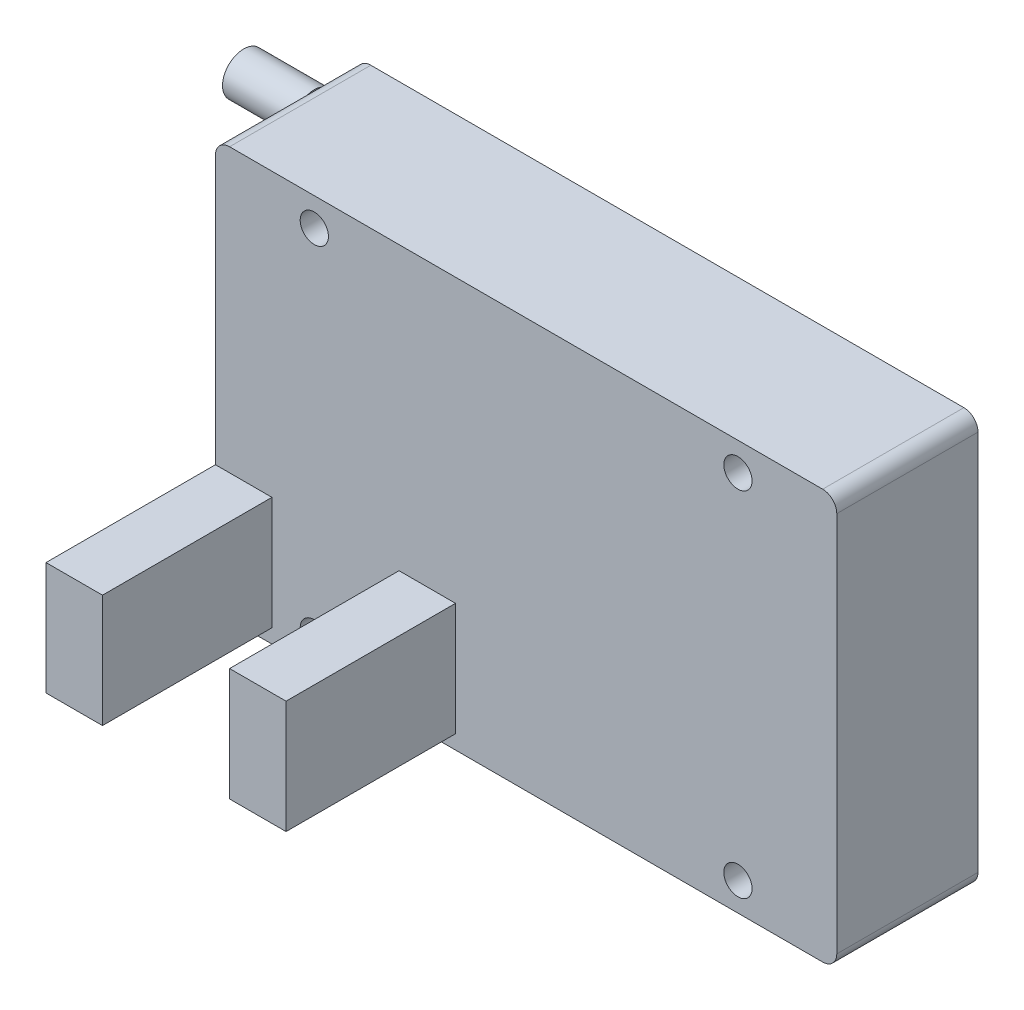
ISO-10303-21;
HEADER;
FILE_DESCRIPTION(('STEP AP214'),'2;1');
FILE_NAME('part.step','',(''),(''),'','','');
FILE_SCHEMA(('AUTOMOTIVE_DESIGN { 1 0 10303 214 1 1 1 1 }'));
ENDSEC;
DATA;
#1=APPLICATION_CONTEXT('core data for automotive mechanical design processes');
#2=APPLICATION_PROTOCOL_DEFINITION('international standard','automotive_design',2000,#1);
#3=PRODUCT_CONTEXT('',#1,'mechanical');
#4=PRODUCT('Part','Part','',(#3));
#5=PRODUCT_RELATED_PRODUCT_CATEGORY('part','',(#4));
#6=PRODUCT_DEFINITION_FORMATION('','',#4);
#7=PRODUCT_DEFINITION_CONTEXT('part definition',#1,'design');
#8=PRODUCT_DEFINITION('design','',#6,#7);
#9=PRODUCT_DEFINITION_SHAPE('','',#8);
#10=(LENGTH_UNIT() NAMED_UNIT(*) SI_UNIT(.MILLI.,.METRE.));
#11=(NAMED_UNIT(*) PLANE_ANGLE_UNIT() SI_UNIT($,.RADIAN.));
#12=(NAMED_UNIT(*) SI_UNIT($,.STERADIAN.) SOLID_ANGLE_UNIT());
#13=UNCERTAINTY_MEASURE_WITH_UNIT(LENGTH_MEASURE(1.E-05),#10,'distance_accuracy_value','');
#14=(GEOMETRIC_REPRESENTATION_CONTEXT(3) GLOBAL_UNCERTAINTY_ASSIGNED_CONTEXT((#13)) GLOBAL_UNIT_ASSIGNED_CONTEXT((#10,
#11,#12)) REPRESENTATION_CONTEXT('',''));
#15=CARTESIAN_POINT('',(0.,0.,0.));
#16=DIRECTION('',(0.,0.,1.));
#17=DIRECTION('',(1.,0.,0.));
#18=AXIS2_PLACEMENT_3D('',#15,#16,#17);
#19=CARTESIAN_POINT('',(21.,-13.5,10.));
#20=DIRECTION('',(0.,0.,-1.));
#21=DIRECTION('',(-1.,0.,0.));
#22=AXIS2_PLACEMENT_3D('',#19,#20,#21);
#23=CYLINDRICAL_SURFACE('',#22,1.);
#24=CARTESIAN_POINT('',(21.,-13.5,0.));
#25=DIRECTION('',(0.,0.,1.));
#26=DIRECTION('',(1.,0.,0.));
#27=AXIS2_PLACEMENT_3D('',#24,#25,#26);
#28=CIRCLE('',#27,1.);
#29=CARTESIAN_POINT('',(21.,-14.5,0.));
#30=VERTEX_POINT('',#29);
#31=CARTESIAN_POINT('',(22.,-13.5,0.));
#32=VERTEX_POINT('',#31);
#33=EDGE_CURVE('E220',#30,#32,#28,.T.);
#34=ORIENTED_EDGE('',*,*,#33,.T.);
#35=DIRECTION('',(0.,0.,-1.));
#36=VECTOR('',#35,1.);
#37=CARTESIAN_POINT('',(22.,-13.5,10.));
#38=LINE('',#37,#36);
#39=CARTESIAN_POINT('',(22.,-13.5,10.));
#40=VERTEX_POINT('',#39);
#41=EDGE_CURVE('E285',#40,#32,#38,.T.);
#42=ORIENTED_EDGE('',*,*,#41,.F.);
#43=CARTESIAN_POINT('',(21.,-13.5,10.));
#44=DIRECTION('',(0.,0.,1.));
#45=DIRECTION('',(1.,0.,0.));
#46=AXIS2_PLACEMENT_3D('',#43,#44,#45);
#47=CIRCLE('',#46,1.);
#48=CARTESIAN_POINT('',(21.,-14.5,10.));
#49=VERTEX_POINT('',#48);
#50=EDGE_CURVE('E223',#49,#40,#47,.T.);
#51=ORIENTED_EDGE('',*,*,#50,.F.);
#52=DIRECTION('',(0.,0.,-1.));
#53=VECTOR('',#52,1.);
#54=CARTESIAN_POINT('',(21.,-14.5,10.));
#55=LINE('',#54,#53);
#56=EDGE_CURVE('E244',#49,#30,#55,.T.);
#57=ORIENTED_EDGE('',*,*,#56,.T.);
#58=EDGE_LOOP('',(#34,#42,#51,#57));
#59=FACE_BOUND('',#58,.T.);
#60=ADVANCED_FACE('F39',(#59),#23,.T.);
#61=CARTESIAN_POINT('',(22.,-13.5,10.));
#62=DIRECTION('',(-1.,0.,0.));
#63=DIRECTION('',(0.,0.,1.));
#64=AXIS2_PLACEMENT_3D('',#61,#62,#63);
#65=PLANE('',#64);
#66=DIRECTION('',(0.,1.,0.));
#67=VECTOR('',#66,1.);
#68=CARTESIAN_POINT('',(22.,-13.5,0.));
#69=LINE('',#68,#67);
#70=CARTESIAN_POINT('',(22.,13.5,0.));
#71=VERTEX_POINT('',#70);
#72=EDGE_CURVE('E249',#32,#71,#69,.T.);
#73=ORIENTED_EDGE('',*,*,#72,.T.);
#74=DIRECTION('',(0.,0.,-1.));
#75=VECTOR('',#74,1.);
#76=CARTESIAN_POINT('',(22.,13.5,10.));
#77=LINE('',#76,#75);
#78=CARTESIAN_POINT('',(22.,13.5,10.));
#79=VERTEX_POINT('',#78);
#80=EDGE_CURVE('E276',#79,#71,#77,.T.);
#81=ORIENTED_EDGE('',*,*,#80,.F.);
#82=DIRECTION('',(0.,1.,0.));
#83=VECTOR('',#82,1.);
#84=CARTESIAN_POINT('',(22.,-13.5,10.));
#85=LINE('',#84,#83);
#86=EDGE_CURVE('E226',#40,#79,#85,.T.);
#87=ORIENTED_EDGE('',*,*,#86,.F.);
#88=ORIENTED_EDGE('',*,*,#41,.T.);
#89=EDGE_LOOP('',(#73,#81,#87,#88));
#90=FACE_BOUND('',#89,.T.);
#91=ADVANCED_FACE('F326',(#90),#65,.F.);
#92=CARTESIAN_POINT('',(21.,13.5,10.));
#93=DIRECTION('',(0.,0.,-1.));
#94=DIRECTION('',(-1.,0.,0.));
#95=AXIS2_PLACEMENT_3D('',#92,#93,#94);
#96=CYLINDRICAL_SURFACE('',#95,1.);
#97=CARTESIAN_POINT('',(21.,13.5,0.));
#98=DIRECTION('',(0.,0.,1.));
#99=DIRECTION('',(1.,0.,0.));
#100=AXIS2_PLACEMENT_3D('',#97,#98,#99);
#101=CIRCLE('',#100,1.);
#102=CARTESIAN_POINT('',(21.,14.5,0.));
#103=VERTEX_POINT('',#102);
#104=EDGE_CURVE('E250',#71,#103,#101,.T.);
#105=ORIENTED_EDGE('',*,*,#104,.T.);
#106=DIRECTION('',(0.,0.,-1.));
#107=VECTOR('',#106,1.);
#108=CARTESIAN_POINT('',(21.,14.5,10.));
#109=LINE('',#108,#107);
#110=CARTESIAN_POINT('',(21.,14.5,10.));
#111=VERTEX_POINT('',#110);
#112=EDGE_CURVE('E277',#111,#103,#109,.T.);
#113=ORIENTED_EDGE('',*,*,#112,.F.);
#114=CARTESIAN_POINT('',(21.,13.5,10.));
#115=DIRECTION('',(0.,0.,1.));
#116=DIRECTION('',(1.,0.,0.));
#117=AXIS2_PLACEMENT_3D('',#114,#115,#116);
#118=CIRCLE('',#117,1.);
#119=EDGE_CURVE('E233',#79,#111,#118,.T.);
#120=ORIENTED_EDGE('',*,*,#119,.F.);
#121=ORIENTED_EDGE('',*,*,#80,.T.);
#122=EDGE_LOOP('',(#105,#113,#120,#121));
#123=FACE_BOUND('',#122,.T.);
#124=ADVANCED_FACE('F332',(#123),#96,.T.);
#125=CARTESIAN_POINT('',(-21.,14.5,10.));
#126=DIRECTION('',(0.,-1.,0.));
#127=DIRECTION('',(1.,0.,0.));
#128=AXIS2_PLACEMENT_3D('',#125,#126,#127);
#129=PLANE('',#128);
#130=DIRECTION('',(-1.,0.,0.));
#131=VECTOR('',#130,1.);
#132=CARTESIAN_POINT('',(-21.,14.5,0.));
#133=LINE('',#132,#131);
#134=CARTESIAN_POINT('',(-21.,14.5,0.));
#135=VERTEX_POINT('',#134);
#136=EDGE_CURVE('E253',#103,#135,#133,.T.);
#137=ORIENTED_EDGE('',*,*,#136,.T.);
#138=DIRECTION('',(0.,0.,-1.));
#139=VECTOR('',#138,1.);
#140=CARTESIAN_POINT('',(-21.,14.5,10.));
#141=LINE('',#140,#139);
#142=CARTESIAN_POINT('',(-21.,14.5,10.));
#143=VERTEX_POINT('',#142);
#144=EDGE_CURVE('E275',#143,#135,#141,.T.);
#145=ORIENTED_EDGE('',*,*,#144,.F.);
#146=DIRECTION('',(-1.,0.,0.));
#147=VECTOR('',#146,1.);
#148=CARTESIAN_POINT('',(-21.,14.5,10.));
#149=LINE('',#148,#147);
#150=EDGE_CURVE('E232',#111,#143,#149,.T.);
#151=ORIENTED_EDGE('',*,*,#150,.F.);
#152=ORIENTED_EDGE('',*,*,#112,.T.);
#153=EDGE_LOOP('',(#137,#145,#151,#152));
#154=FACE_BOUND('',#153,.T.);
#155=ADVANCED_FACE('F364',(#154),#129,.F.);
#156=CARTESIAN_POINT('',(-21.,13.5,10.));
#157=DIRECTION('',(0.,0.,-1.));
#158=DIRECTION('',(-1.,0.,0.));
#159=AXIS2_PLACEMENT_3D('',#156,#157,#158);
#160=CYLINDRICAL_SURFACE('',#159,1.);
#161=CARTESIAN_POINT('',(-21.,13.5,0.));
#162=DIRECTION('',(0.,0.,1.));
#163=DIRECTION('',(-1.,0.,0.));
#164=AXIS2_PLACEMENT_3D('',#161,#162,#163);
#165=CIRCLE('',#164,1.);
#166=CARTESIAN_POINT('',(-22.,13.5,0.));
#167=VERTEX_POINT('',#166);
#168=EDGE_CURVE('E251',#135,#167,#165,.T.);
#169=ORIENTED_EDGE('',*,*,#168,.T.);
#170=DIRECTION('',(0.,0.,-1.));
#171=VECTOR('',#170,1.);
#172=CARTESIAN_POINT('',(-22.,13.5,10.));
#173=LINE('',#172,#171);
#174=CARTESIAN_POINT('',(-22.,13.5,1.8819660112501));
#175=VERTEX_POINT('',#174);
#176=EDGE_CURVE('E267',#175,#167,#173,.T.);
#177=ORIENTED_EDGE('',*,*,#176,.F.);
#178=CARTESIAN_POINT('',(-22.,13.5,4.1180339887499));
#179=VERTEX_POINT('',#178);
#180=EDGE_CURVE('E272',#179,#175,#173,.T.);
#181=ORIENTED_EDGE('',*,*,#180,.F.);
#182=CARTESIAN_POINT('',(-22.,13.5,10.));
#183=VERTEX_POINT('',#182);
#184=EDGE_CURVE('E269',#183,#179,#173,.T.);
#185=ORIENTED_EDGE('',*,*,#184,.F.);
#186=CARTESIAN_POINT('',(-21.,13.5,10.));
#187=DIRECTION('',(0.,0.,1.));
#188=DIRECTION('',(-1.,0.,0.));
#189=AXIS2_PLACEMENT_3D('',#186,#187,#188);
#190=CIRCLE('',#189,1.);
#191=EDGE_CURVE('E231',#143,#183,#190,.T.);
#192=ORIENTED_EDGE('',*,*,#191,.F.);
#193=ORIENTED_EDGE('',*,*,#144,.T.);
#194=EDGE_LOOP('',(#169,#177,#181,#185,#192,#193));
#195=FACE_BOUND('',#194,.T.);
#196=ADVANCED_FACE('F297',(#195),#160,.T.);
#197=CARTESIAN_POINT('',(-22.,-13.5,10.));
#198=DIRECTION('',(1.,0.,0.));
#199=DIRECTION('',(0.,0.,-1.));
#200=AXIS2_PLACEMENT_3D('',#197,#198,#199);
#201=PLANE('',#200);
#202=CARTESIAN_POINT('',(-22.,12.5,3.));
#203=DIRECTION('',(-1.,0.,0.));
#204=DIRECTION('',(0.,0.,1.));
#205=AXIS2_PLACEMENT_3D('',#202,#203,#204);
#206=CIRCLE('',#205,1.5);
#207=EDGE_CURVE('E11',#175,#179,#206,.T.);
#208=ORIENTED_EDGE('',*,*,#207,.F.);
#209=ORIENTED_EDGE('',*,*,#176,.T.);
#210=DIRECTION('',(0.,-1.,0.));
#211=VECTOR('',#210,1.);
#212=CARTESIAN_POINT('',(-22.,-13.5,0.));
#213=LINE('',#212,#211);
#214=CARTESIAN_POINT('',(-22.,-13.5,0.));
#215=VERTEX_POINT('',#214);
#216=EDGE_CURVE('E258',#167,#215,#213,.T.);
#217=ORIENTED_EDGE('',*,*,#216,.T.);
#218=DIRECTION('',(0.,0.,-1.));
#219=VECTOR('',#218,1.);
#220=CARTESIAN_POINT('',(-22.,-13.5,10.));
#221=LINE('',#220,#219);
#222=CARTESIAN_POINT('',(-22.,-13.5,10.));
#223=VERTEX_POINT('',#222);
#224=EDGE_CURVE('E266',#223,#215,#221,.T.);
#225=ORIENTED_EDGE('',*,*,#224,.F.);
#226=DIRECTION('',(0.,0.,-1.));
#227=VECTOR('',#226,1.);
#228=CARTESIAN_POINT('',(-22.,-13.5,22.));
#229=LINE('',#228,#227);
#230=CARTESIAN_POINT('',(-22.,-13.5,22.));
#231=VERTEX_POINT('',#230);
#232=EDGE_CURVE('E208',#231,#223,#229,.T.);
#233=ORIENTED_EDGE('',*,*,#232,.F.);
#234=DIRECTION('',(0.,-1.,0.));
#235=VECTOR('',#234,1.);
#236=CARTESIAN_POINT('',(-22.,0.,22.));
#237=LINE('',#236,#235);
#238=CARTESIAN_POINT('',(-22.,-5.5,22.));
#239=VERTEX_POINT('',#238);
#240=EDGE_CURVE('E192',#239,#231,#237,.T.);
#241=ORIENTED_EDGE('',*,*,#240,.F.);
#242=DIRECTION('',(0.,0.,-1.));
#243=VECTOR('',#242,1.);
#244=CARTESIAN_POINT('',(-22.,-5.5,22.));
#245=LINE('',#244,#243);
#246=CARTESIAN_POINT('',(-22.,-5.5,10.));
#247=VERTEX_POINT('',#246);
#248=EDGE_CURVE('E209',#239,#247,#245,.T.);
#249=ORIENTED_EDGE('',*,*,#248,.T.);
#250=DIRECTION('',(0.,-1.,0.));
#251=VECTOR('',#250,1.);
#252=CARTESIAN_POINT('',(-22.,-13.5,10.));
#253=LINE('',#252,#251);
#254=EDGE_CURVE('E240',#183,#247,#253,.T.);
#255=ORIENTED_EDGE('',*,*,#254,.F.);
#256=ORIENTED_EDGE('',*,*,#184,.T.);
#257=EDGE_LOOP('',(#208,#209,#217,#225,#233,#241,#249,#255,#256));
#258=FACE_BOUND('',#257,.T.);
#259=CARTESIAN_POINT('',(-22.,-0.500000000000007,3.));
#260=DIRECTION('',(1.,0.,0.));
#261=DIRECTION('',(0.,0.,-1.));
#262=AXIS2_PLACEMENT_3D('',#259,#260,#261);
#263=CIRCLE('',#262,1.5);
#264=CARTESIAN_POINT('',(-22.,-0.500000000000007,1.5));
#265=VERTEX_POINT('',#264);
#266=EDGE_CURVE('E45',#265,#265,#263,.F.);
#267=ORIENTED_EDGE('',*,*,#266,.F.);
#268=EDGE_LOOP('',(#267));
#269=FACE_BOUND('',#268,.T.);
#270=CARTESIAN_POINT('',(-22.,-6.50000000000001,3.));
#271=DIRECTION('',(1.,0.,0.));
#272=DIRECTION('',(0.,0.,-1.));
#273=AXIS2_PLACEMENT_3D('',#270,#271,#272);
#274=CIRCLE('',#273,1.5);
#275=CARTESIAN_POINT('',(-22.,-6.50000000000001,1.5));
#276=VERTEX_POINT('',#275);
#277=EDGE_CURVE('E289',#276,#276,#274,.F.);
#278=ORIENTED_EDGE('',*,*,#277,.F.);
#279=EDGE_LOOP('',(#278));
#280=FACE_BOUND('',#279,.T.);
#281=CARTESIAN_POINT('',(-22.,-11.5,3.));
#282=DIRECTION('',(1.,0.,0.));
#283=DIRECTION('',(0.,0.,-1.));
#284=AXIS2_PLACEMENT_3D('',#281,#282,#283);
#285=CIRCLE('',#284,1.5);
#286=CARTESIAN_POINT('',(-22.,-11.5,1.5));
#287=VERTEX_POINT('',#286);
#288=EDGE_CURVE('E282',#287,#287,#285,.F.);
#289=ORIENTED_EDGE('',*,*,#288,.F.);
#290=EDGE_LOOP('',(#289));
#291=FACE_BOUND('',#290,.T.);
#292=ADVANCED_FACE('F298',(#258,#269,#280,#291),#201,.F.);
#293=CARTESIAN_POINT('',(-21.,-13.5,10.));
#294=DIRECTION('',(0.,0.,-1.));
#295=DIRECTION('',(-1.,0.,0.));
#296=AXIS2_PLACEMENT_3D('',#293,#294,#295);
#297=CYLINDRICAL_SURFACE('',#296,1.);
#298=CARTESIAN_POINT('',(-21.,-13.5,0.));
#299=DIRECTION('',(0.,0.,1.));
#300=DIRECTION('',(1.,0.,0.));
#301=AXIS2_PLACEMENT_3D('',#298,#299,#300);
#302=CIRCLE('',#301,1.);
#303=CARTESIAN_POINT('',(-21.,-14.5,0.));
#304=VERTEX_POINT('',#303);
#305=EDGE_CURVE('E256',#215,#304,#302,.T.);
#306=ORIENTED_EDGE('',*,*,#305,.T.);
#307=DIRECTION('',(0.,0.,-1.));
#308=VECTOR('',#307,1.);
#309=CARTESIAN_POINT('',(-21.,-14.5,10.));
#310=LINE('',#309,#308);
#311=CARTESIAN_POINT('',(-21.,-14.5,10.));
#312=VERTEX_POINT('',#311);
#313=EDGE_CURVE('E263',#312,#304,#310,.T.);
#314=ORIENTED_EDGE('',*,*,#313,.F.);
#315=CARTESIAN_POINT('',(-21.,-13.5,10.));
#316=DIRECTION('',(0.,0.,1.));
#317=DIRECTION('',(1.,0.,0.));
#318=AXIS2_PLACEMENT_3D('',#315,#316,#317);
#319=CIRCLE('',#318,1.);
#320=EDGE_CURVE('E238',#223,#312,#319,.T.);
#321=ORIENTED_EDGE('',*,*,#320,.F.);
#322=ORIENTED_EDGE('',*,*,#224,.T.);
#323=EDGE_LOOP('',(#306,#314,#321,#322));
#324=FACE_BOUND('',#323,.T.);
#325=ADVANCED_FACE('F299',(#324),#297,.T.);
#326=CARTESIAN_POINT('',(-21.,-14.5,10.));
#327=DIRECTION('',(0.,1.,0.));
#328=DIRECTION('',(-1.,0.,0.));
#329=AXIS2_PLACEMENT_3D('',#326,#327,#328);
#330=PLANE('',#329);
#331=DIRECTION('',(1.,0.,0.));
#332=VECTOR('',#331,1.);
#333=CARTESIAN_POINT('',(-21.,-14.5,0.));
#334=LINE('',#333,#332);
#335=EDGE_CURVE('E229',#304,#30,#334,.T.);
#336=ORIENTED_EDGE('',*,*,#335,.T.);
#337=ORIENTED_EDGE('',*,*,#56,.F.);
#338=DIRECTION('',(1.,0.,0.));
#339=VECTOR('',#338,1.);
#340=CARTESIAN_POINT('',(-21.,-14.5,10.));
#341=LINE('',#340,#339);
#342=EDGE_CURVE('E245',#312,#49,#341,.T.);
#343=ORIENTED_EDGE('',*,*,#342,.F.);
#344=ORIENTED_EDGE('',*,*,#313,.T.);
#345=EDGE_LOOP('',(#336,#337,#343,#344));
#346=FACE_BOUND('',#345,.T.);
#347=ADVANCED_FACE('F348',(#346),#330,.F.);
#348=CARTESIAN_POINT('',(21.,-13.5,10.));
#349=DIRECTION('',(0.,0.,1.));
#350=DIRECTION('',(1.,0.,0.));
#351=AXIS2_PLACEMENT_3D('',#348,#349,#350);
#352=PLANE('',#351);
#353=CARTESIAN_POINT('',(-15.,12.5,10.));
#354=DIRECTION('',(0.,0.,1.));
#355=DIRECTION('',(1.,0.,0.));
#356=AXIS2_PLACEMENT_3D('',#353,#354,#355);
#357=CIRCLE('',#356,1.);
#358=CARTESIAN_POINT('',(-14.,12.5,10.));
#359=VERTEX_POINT('',#358);
#360=EDGE_CURVE('E205',#359,#359,#357,.T.);
#361=ORIENTED_EDGE('',*,*,#360,.F.);
#362=EDGE_LOOP('',(#361));
#363=FACE_BOUND('',#362,.T.);
#364=CARTESIAN_POINT('',(15.,12.5,10.));
#365=DIRECTION('',(0.,0.,1.));
#366=DIRECTION('',(1.,0.,0.));
#367=AXIS2_PLACEMENT_3D('',#364,#365,#366);
#368=CIRCLE('',#367,1.);
#369=CARTESIAN_POINT('',(16.,12.5,10.));
#370=VERTEX_POINT('',#369);
#371=EDGE_CURVE('E595',#370,#370,#368,.T.);
#372=ORIENTED_EDGE('',*,*,#371,.F.);
#373=EDGE_LOOP('',(#372));
#374=FACE_BOUND('',#373,.T.);
#375=CARTESIAN_POINT('',(15.,-12.5,10.));
#376=DIRECTION('',(0.,0.,1.));
#377=DIRECTION('',(1.,0.,0.));
#378=AXIS2_PLACEMENT_3D('',#375,#376,#377);
#379=CIRCLE('',#378,1.);
#380=CARTESIAN_POINT('',(16.,-12.5,10.));
#381=VERTEX_POINT('',#380);
#382=EDGE_CURVE('E589',#381,#381,#379,.T.);
#383=ORIENTED_EDGE('',*,*,#382,.F.);
#384=EDGE_LOOP('',(#383));
#385=FACE_BOUND('',#384,.T.);
#386=CARTESIAN_POINT('',(-15.,-12.5,10.));
#387=DIRECTION('',(0.,0.,1.));
#388=DIRECTION('',(1.,0.,0.));
#389=AXIS2_PLACEMENT_3D('',#386,#387,#388);
#390=CIRCLE('',#389,1.);
#391=CARTESIAN_POINT('',(-14.,-12.5,10.));
#392=VERTEX_POINT('',#391);
#393=EDGE_CURVE('E588',#392,#392,#390,.T.);
#394=ORIENTED_EDGE('',*,*,#393,.F.);
#395=EDGE_LOOP('',(#394));
#396=FACE_BOUND('',#395,.T.);
#397=DIRECTION('',(0.,-1.,0.));
#398=VECTOR('',#397,1.);
#399=CARTESIAN_POINT('',(-9.,0.,10.));
#400=LINE('',#399,#398);
#401=CARTESIAN_POINT('',(-9.,-5.5,10.));
#402=VERTEX_POINT('',#401);
#403=CARTESIAN_POINT('',(-9.,-13.5,10.));
#404=VERTEX_POINT('',#403);
#405=EDGE_CURVE('E54',#402,#404,#400,.T.);
#406=ORIENTED_EDGE('',*,*,#405,.F.);
#407=DIRECTION('',(1.,0.,0.));
#408=VECTOR('',#407,1.);
#409=CARTESIAN_POINT('',(0.,-5.5,10.));
#410=LINE('',#409,#408);
#411=CARTESIAN_POINT('',(-5.,-5.5,10.));
#412=VERTEX_POINT('',#411);
#413=EDGE_CURVE('E58',#402,#412,#410,.T.);
#414=ORIENTED_EDGE('',*,*,#413,.T.);
#415=DIRECTION('',(0.,-1.,0.));
#416=VECTOR('',#415,1.);
#417=CARTESIAN_POINT('',(-5.,0.,10.));
#418=LINE('',#417,#416);
#419=CARTESIAN_POINT('',(-5.,-13.5,10.));
#420=VERTEX_POINT('',#419);
#421=EDGE_CURVE('E605',#412,#420,#418,.T.);
#422=ORIENTED_EDGE('',*,*,#421,.T.);
#423=DIRECTION('',(1.,0.,0.));
#424=VECTOR('',#423,1.);
#425=CARTESIAN_POINT('',(0.,-13.5,10.));
#426=LINE('',#425,#424);
#427=EDGE_CURVE('E599',#404,#420,#426,.T.);
#428=ORIENTED_EDGE('',*,*,#427,.F.);
#429=EDGE_LOOP('',(#406,#414,#422,#428));
#430=FACE_BOUND('',#429,.T.);
#431=DIRECTION('',(1.,0.,0.));
#432=VECTOR('',#431,1.);
#433=CARTESIAN_POINT('',(0.,-13.5,10.));
#434=LINE('',#433,#432);
#435=CARTESIAN_POINT('',(-18.,-13.5,10.));
#436=VERTEX_POINT('',#435);
#437=EDGE_CURVE('E187',#223,#436,#434,.T.);
#438=ORIENTED_EDGE('',*,*,#437,.F.);
#439=ORIENTED_EDGE('',*,*,#320,.T.);
#440=ORIENTED_EDGE('',*,*,#342,.T.);
#441=ORIENTED_EDGE('',*,*,#50,.T.);
#442=ORIENTED_EDGE('',*,*,#86,.T.);
#443=ORIENTED_EDGE('',*,*,#119,.T.);
#444=ORIENTED_EDGE('',*,*,#150,.T.);
#445=ORIENTED_EDGE('',*,*,#191,.T.);
#446=ORIENTED_EDGE('',*,*,#254,.T.);
#447=DIRECTION('',(1.,0.,0.));
#448=VECTOR('',#447,1.);
#449=CARTESIAN_POINT('',(0.,-5.5,10.));
#450=LINE('',#449,#448);
#451=CARTESIAN_POINT('',(-18.,-5.5,10.));
#452=VERTEX_POINT('',#451);
#453=EDGE_CURVE('E203',#247,#452,#450,.T.);
#454=ORIENTED_EDGE('',*,*,#453,.T.);
#455=DIRECTION('',(0.,-1.,0.));
#456=VECTOR('',#455,1.);
#457=CARTESIAN_POINT('',(-18.,0.,10.));
#458=LINE('',#457,#456);
#459=EDGE_CURVE('E196',#452,#436,#458,.T.);
#460=ORIENTED_EDGE('',*,*,#459,.T.);
#461=EDGE_LOOP('',(#438,#439,#440,#441,#442,#443,#444,#445,#446,#454,#460));
#462=FACE_BOUND('',#461,.T.);
#463=ADVANCED_FACE('F319',(#363,#374,#385,#396,#430,#462),#352,.T.);
#464=CARTESIAN_POINT('',(21.,-13.5,0.));
#465=DIRECTION('',(0.,0.,1.));
#466=DIRECTION('',(1.,0.,0.));
#467=AXIS2_PLACEMENT_3D('',#464,#465,#466);
#468=PLANE('',#467);
#469=CARTESIAN_POINT('',(-15.,12.5,0.));
#470=DIRECTION('',(0.,0.,-1.));
#471=DIRECTION('',(-1.,0.,0.));
#472=AXIS2_PLACEMENT_3D('',#469,#470,#471);
#473=CIRCLE('',#472,1.);
#474=CARTESIAN_POINT('',(-16.,12.5,0.));
#475=VERTEX_POINT('',#474);
#476=EDGE_CURVE('E572',#475,#475,#473,.T.);
#477=ORIENTED_EDGE('',*,*,#476,.F.);
#478=EDGE_LOOP('',(#477));
#479=FACE_BOUND('',#478,.T.);
#480=CARTESIAN_POINT('',(15.,12.5,0.));
#481=DIRECTION('',(0.,0.,-1.));
#482=DIRECTION('',(-1.,0.,0.));
#483=AXIS2_PLACEMENT_3D('',#480,#481,#482);
#484=CIRCLE('',#483,1.);
#485=CARTESIAN_POINT('',(14.,12.5,0.));
#486=VERTEX_POINT('',#485);
#487=EDGE_CURVE('E578',#486,#486,#484,.T.);
#488=ORIENTED_EDGE('',*,*,#487,.F.);
#489=EDGE_LOOP('',(#488));
#490=FACE_BOUND('',#489,.T.);
#491=CARTESIAN_POINT('',(15.,-12.5,0.));
#492=DIRECTION('',(0.,0.,-1.));
#493=DIRECTION('',(-1.,0.,0.));
#494=AXIS2_PLACEMENT_3D('',#491,#492,#493);
#495=CIRCLE('',#494,1.);
#496=CARTESIAN_POINT('',(14.,-12.5,0.));
#497=VERTEX_POINT('',#496);
#498=EDGE_CURVE('E580',#497,#497,#495,.T.);
#499=ORIENTED_EDGE('',*,*,#498,.F.);
#500=EDGE_LOOP('',(#499));
#501=FACE_BOUND('',#500,.T.);
#502=CARTESIAN_POINT('',(-15.,-12.5,0.));
#503=DIRECTION('',(0.,0.,-1.));
#504=DIRECTION('',(-1.,0.,0.));
#505=AXIS2_PLACEMENT_3D('',#502,#503,#504);
#506=CIRCLE('',#505,1.);
#507=CARTESIAN_POINT('',(-16.,-12.5,0.));
#508=VERTEX_POINT('',#507);
#509=EDGE_CURVE('E581',#508,#508,#506,.T.);
#510=ORIENTED_EDGE('',*,*,#509,.F.);
#511=EDGE_LOOP('',(#510));
#512=FACE_BOUND('',#511,.T.);
#513=ORIENTED_EDGE('',*,*,#33,.F.);
#514=ORIENTED_EDGE('',*,*,#335,.F.);
#515=ORIENTED_EDGE('',*,*,#305,.F.);
#516=ORIENTED_EDGE('',*,*,#216,.F.);
#517=ORIENTED_EDGE('',*,*,#168,.F.);
#518=ORIENTED_EDGE('',*,*,#136,.F.);
#519=ORIENTED_EDGE('',*,*,#104,.F.);
#520=ORIENTED_EDGE('',*,*,#72,.F.);
#521=EDGE_LOOP('',(#513,#514,#515,#516,#517,#518,#519,#520));
#522=FACE_BOUND('',#521,.T.);
#523=ADVANCED_FACE('F310',(#479,#490,#501,#512,#522),#468,.F.);
#524=CARTESIAN_POINT('',(-27.,-11.5,3.));
#525=DIRECTION('',(1.,0.,0.));
#526=DIRECTION('',(0.,0.,-1.));
#527=AXIS2_PLACEMENT_3D('',#524,#525,#526);
#528=CYLINDRICAL_SURFACE('',#527,1.5);
#529=CARTESIAN_POINT('',(-27.,-11.5,3.));
#530=DIRECTION('',(-1.,0.,0.));
#531=DIRECTION('',(0.,0.,1.));
#532=AXIS2_PLACEMENT_3D('',#529,#530,#531);
#533=CIRCLE('',#532,1.5);
#534=CARTESIAN_POINT('',(-27.,-11.5,4.5));
#535=VERTEX_POINT('',#534);
#536=EDGE_CURVE('E179',#535,#535,#533,.T.);
#537=ORIENTED_EDGE('',*,*,#536,.F.);
#538=EDGE_LOOP('',(#537));
#539=FACE_BOUND('',#538,.T.);
#540=ORIENTED_EDGE('',*,*,#288,.T.);
#541=EDGE_LOOP('',(#540));
#542=FACE_BOUND('',#541,.T.);
#543=ADVANCED_FACE('F308',(#539,#542),#528,.T.);
#544=CARTESIAN_POINT('',(-27.,-11.5,3.));
#545=DIRECTION('',(-1.,0.,0.));
#546=DIRECTION('',(0.,0.,1.));
#547=AXIS2_PLACEMENT_3D('',#544,#545,#546);
#548=PLANE('',#547);
#549=ORIENTED_EDGE('',*,*,#536,.T.);
#550=EDGE_LOOP('',(#549));
#551=FACE_BOUND('',#550,.T.);
#552=ADVANCED_FACE('F306',(#551),#548,.T.);
#553=CARTESIAN_POINT('',(-27.,-6.50000000000001,3.));
#554=DIRECTION('',(1.,0.,0.));
#555=DIRECTION('',(0.,0.,-1.));
#556=AXIS2_PLACEMENT_3D('',#553,#554,#555);
#557=CYLINDRICAL_SURFACE('',#556,1.5);
#558=CARTESIAN_POINT('',(-27.,-6.50000000000001,3.));
#559=DIRECTION('',(-1.,0.,0.));
#560=DIRECTION('',(0.,0.,1.));
#561=AXIS2_PLACEMENT_3D('',#558,#559,#560);
#562=CIRCLE('',#561,1.5);
#563=CARTESIAN_POINT('',(-27.,-6.50000000000001,4.5));
#564=VERTEX_POINT('',#563);
#565=EDGE_CURVE('E176',#564,#564,#562,.T.);
#566=ORIENTED_EDGE('',*,*,#565,.F.);
#567=EDGE_LOOP('',(#566));
#568=FACE_BOUND('',#567,.T.);
#569=ORIENTED_EDGE('',*,*,#277,.T.);
#570=EDGE_LOOP('',(#569));
#571=FACE_BOUND('',#570,.T.);
#572=ADVANCED_FACE('F316',(#568,#571),#557,.T.);
#573=CARTESIAN_POINT('',(-27.,-6.50000000000001,3.));
#574=DIRECTION('',(-1.,0.,0.));
#575=DIRECTION('',(0.,0.,1.));
#576=AXIS2_PLACEMENT_3D('',#573,#574,#575);
#577=PLANE('',#576);
#578=ORIENTED_EDGE('',*,*,#565,.T.);
#579=EDGE_LOOP('',(#578));
#580=FACE_BOUND('',#579,.T.);
#581=ADVANCED_FACE('F414',(#580),#577,.T.);
#582=CARTESIAN_POINT('',(-27.,-0.500000000000007,3.));
#583=DIRECTION('',(1.,0.,0.));
#584=DIRECTION('',(0.,0.,-1.));
#585=AXIS2_PLACEMENT_3D('',#582,#583,#584);
#586=CYLINDRICAL_SURFACE('',#585,1.5);
#587=CARTESIAN_POINT('',(-27.,-0.500000000000007,3.));
#588=DIRECTION('',(-1.,0.,0.));
#589=DIRECTION('',(0.,0.,1.));
#590=AXIS2_PLACEMENT_3D('',#587,#588,#589);
#591=CIRCLE('',#590,1.5);
#592=CARTESIAN_POINT('',(-27.,-0.500000000000007,4.5));
#593=VERTEX_POINT('',#592);
#594=EDGE_CURVE('E219',#593,#593,#591,.T.);
#595=ORIENTED_EDGE('',*,*,#594,.F.);
#596=EDGE_LOOP('',(#595));
#597=FACE_BOUND('',#596,.T.);
#598=ORIENTED_EDGE('',*,*,#266,.T.);
#599=EDGE_LOOP('',(#598));
#600=FACE_BOUND('',#599,.T.);
#601=ADVANCED_FACE('F294',(#597,#600),#586,.T.);
#602=CARTESIAN_POINT('',(-27.,-0.500000000000007,3.));
#603=DIRECTION('',(-1.,0.,0.));
#604=DIRECTION('',(0.,0.,1.));
#605=AXIS2_PLACEMENT_3D('',#602,#603,#604);
#606=PLANE('',#605);
#607=ORIENTED_EDGE('',*,*,#594,.T.);
#608=EDGE_LOOP('',(#607));
#609=FACE_BOUND('',#608,.T.);
#610=ADVANCED_FACE('F403',(#609),#606,.T.);
#611=CARTESIAN_POINT('',(-22.,12.5,3.));
#612=DIRECTION('',(-1.,0.,0.));
#613=DIRECTION('',(0.,0.,1.));
#614=AXIS2_PLACEMENT_3D('',#611,#612,#613);
#615=PLANE('',#614);
#616=EDGE_CURVE('E48',#179,#175,#206,.T.);
#617=ORIENTED_EDGE('',*,*,#616,.F.);
#618=ORIENTED_EDGE('',*,*,#180,.T.);
#619=EDGE_LOOP('',(#617,#618));
#620=FACE_BOUND('',#619,.T.);
#621=ADVANCED_FACE('F405',(#620),#615,.F.);
#622=CARTESIAN_POINT('',(-27.,12.5,3.));
#623=DIRECTION('',(1.,0.,0.));
#624=DIRECTION('',(0.,0.,-1.));
#625=AXIS2_PLACEMENT_3D('',#622,#623,#624);
#626=CYLINDRICAL_SURFACE('',#625,1.5);
#627=CARTESIAN_POINT('',(-27.,12.5,3.));
#628=DIRECTION('',(-1.,0.,0.));
#629=DIRECTION('',(0.,0.,1.));
#630=AXIS2_PLACEMENT_3D('',#627,#628,#629);
#631=CIRCLE('',#630,1.5);
#632=CARTESIAN_POINT('',(-27.,12.5,4.5));
#633=VERTEX_POINT('',#632);
#634=EDGE_CURVE('E214',#633,#633,#631,.T.);
#635=ORIENTED_EDGE('',*,*,#634,.F.);
#636=EDGE_LOOP('',(#635));
#637=FACE_BOUND('',#636,.T.);
#638=ORIENTED_EDGE('',*,*,#616,.T.);
#639=ORIENTED_EDGE('',*,*,#207,.T.);
#640=EDGE_LOOP('',(#638,#639));
#641=FACE_BOUND('',#640,.T.);
#642=ADVANCED_FACE('F396',(#637,#641),#626,.T.);
#643=CARTESIAN_POINT('',(-27.,12.5,3.));
#644=DIRECTION('',(-1.,0.,0.));
#645=DIRECTION('',(0.,0.,1.));
#646=AXIS2_PLACEMENT_3D('',#643,#644,#645);
#647=PLANE('',#646);
#648=ORIENTED_EDGE('',*,*,#634,.T.);
#649=EDGE_LOOP('',(#648));
#650=FACE_BOUND('',#649,.T.);
#651=ADVANCED_FACE('F399',(#650),#647,.T.);
#652=CARTESIAN_POINT('',(-18.,0.,22.));
#653=DIRECTION('',(1.,0.,0.));
#654=DIRECTION('',(0.,0.,-1.));
#655=AXIS2_PLACEMENT_3D('',#652,#653,#654);
#656=PLANE('',#655);
#657=ORIENTED_EDGE('',*,*,#459,.F.);
#658=DIRECTION('',(0.,0.,-1.));
#659=VECTOR('',#658,1.);
#660=CARTESIAN_POINT('',(-18.,-5.5,22.));
#661=LINE('',#660,#659);
#662=CARTESIAN_POINT('',(-18.,-5.5,22.));
#663=VERTEX_POINT('',#662);
#664=EDGE_CURVE('E215',#663,#452,#661,.T.);
#665=ORIENTED_EDGE('',*,*,#664,.F.);
#666=DIRECTION('',(0.,-1.,0.));
#667=VECTOR('',#666,1.);
#668=CARTESIAN_POINT('',(-18.,0.,22.));
#669=LINE('',#668,#667);
#670=CARTESIAN_POINT('',(-18.,-13.5,22.));
#671=VERTEX_POINT('',#670);
#672=EDGE_CURVE('E188',#663,#671,#669,.T.);
#673=ORIENTED_EDGE('',*,*,#672,.T.);
#674=DIRECTION('',(0.,0.,-1.));
#675=VECTOR('',#674,1.);
#676=CARTESIAN_POINT('',(-18.,-13.5,22.));
#677=LINE('',#676,#675);
#678=EDGE_CURVE('E197',#671,#436,#677,.T.);
#679=ORIENTED_EDGE('',*,*,#678,.T.);
#680=EDGE_LOOP('',(#657,#665,#673,#679));
#681=FACE_BOUND('',#680,.T.);
#682=ADVANCED_FACE('F374',(#681),#656,.T.);
#683=CARTESIAN_POINT('',(0.,-5.5,22.));
#684=DIRECTION('',(0.,1.,0.));
#685=DIRECTION('',(0.,0.,1.));
#686=AXIS2_PLACEMENT_3D('',#683,#684,#685);
#687=PLANE('',#686);
#688=ORIENTED_EDGE('',*,*,#453,.F.);
#689=ORIENTED_EDGE('',*,*,#248,.F.);
#690=DIRECTION('',(1.,0.,0.));
#691=VECTOR('',#690,1.);
#692=CARTESIAN_POINT('',(0.,-5.5,22.));
#693=LINE('',#692,#691);
#694=EDGE_CURVE('E189',#239,#663,#693,.T.);
#695=ORIENTED_EDGE('',*,*,#694,.T.);
#696=ORIENTED_EDGE('',*,*,#664,.T.);
#697=EDGE_LOOP('',(#688,#689,#695,#696));
#698=FACE_BOUND('',#697,.T.);
#699=ADVANCED_FACE('F373',(#698),#687,.T.);
#700=CARTESIAN_POINT('',(0.,-13.5,22.));
#701=DIRECTION('',(0.,1.,0.));
#702=DIRECTION('',(0.,0.,1.));
#703=AXIS2_PLACEMENT_3D('',#700,#701,#702);
#704=PLANE('',#703);
#705=ORIENTED_EDGE('',*,*,#437,.T.);
#706=ORIENTED_EDGE('',*,*,#678,.F.);
#707=DIRECTION('',(1.,0.,0.));
#708=VECTOR('',#707,1.);
#709=CARTESIAN_POINT('',(0.,-13.5,22.));
#710=LINE('',#709,#708);
#711=EDGE_CURVE('E191',#231,#671,#710,.T.);
#712=ORIENTED_EDGE('',*,*,#711,.F.);
#713=ORIENTED_EDGE('',*,*,#232,.T.);
#714=EDGE_LOOP('',(#705,#706,#712,#713));
#715=FACE_BOUND('',#714,.T.);
#716=ADVANCED_FACE('F379',(#715),#704,.F.);
#717=CARTESIAN_POINT('',(0.,0.,22.));
#718=DIRECTION('',(0.,0.,1.));
#719=DIRECTION('',(1.,0.,0.));
#720=AXIS2_PLACEMENT_3D('',#717,#718,#719);
#721=PLANE('',#720);
#722=ORIENTED_EDGE('',*,*,#672,.F.);
#723=ORIENTED_EDGE('',*,*,#694,.F.);
#724=ORIENTED_EDGE('',*,*,#240,.T.);
#725=ORIENTED_EDGE('',*,*,#711,.T.);
#726=EDGE_LOOP('',(#722,#723,#724,#725));
#727=FACE_BOUND('',#726,.T.);
#728=ADVANCED_FACE('F385',(#727),#721,.T.);
#729=CARTESIAN_POINT('',(-9.,0.,22.));
#730=DIRECTION('',(1.,0.,0.));
#731=DIRECTION('',(0.,1.,0.));
#732=AXIS2_PLACEMENT_3D('',#729,#730,#731);
#733=PLANE('',#732);
#734=ORIENTED_EDGE('',*,*,#405,.T.);
#735=DIRECTION('',(0.,0.,-1.));
#736=VECTOR('',#735,1.);
#737=CARTESIAN_POINT('',(-9.,-13.5,22.));
#738=LINE('',#737,#736);
#739=CARTESIAN_POINT('',(-9.,-13.5,22.));
#740=VERTEX_POINT('',#739);
#741=EDGE_CURVE('E159',#740,#404,#738,.T.);
#742=ORIENTED_EDGE('',*,*,#741,.F.);
#743=DIRECTION('',(0.,-1.,0.));
#744=VECTOR('',#743,1.);
#745=CARTESIAN_POINT('',(-9.,0.,22.));
#746=LINE('',#745,#744);
#747=CARTESIAN_POINT('',(-9.,-5.5,22.));
#748=VERTEX_POINT('',#747);
#749=EDGE_CURVE('E170',#748,#740,#746,.T.);
#750=ORIENTED_EDGE('',*,*,#749,.F.);
#751=DIRECTION('',(0.,0.,-1.));
#752=VECTOR('',#751,1.);
#753=CARTESIAN_POINT('',(-9.,-5.5,22.));
#754=LINE('',#753,#752);
#755=EDGE_CURVE('E598',#748,#402,#754,.T.);
#756=ORIENTED_EDGE('',*,*,#755,.T.);
#757=EDGE_LOOP('',(#734,#742,#750,#756));
#758=FACE_BOUND('',#757,.T.);
#759=ADVANCED_FACE('F178',(#758),#733,.F.);
#760=CARTESIAN_POINT('',(0.,-13.5,22.));
#761=DIRECTION('',(0.,1.,0.));
#762=DIRECTION('',(0.,0.,1.));
#763=AXIS2_PLACEMENT_3D('',#760,#761,#762);
#764=PLANE('',#763);
#765=ORIENTED_EDGE('',*,*,#427,.T.);
#766=DIRECTION('',(0.,0.,-1.));
#767=VECTOR('',#766,1.);
#768=CARTESIAN_POINT('',(-5.,-13.5,22.));
#769=LINE('',#768,#767);
#770=CARTESIAN_POINT('',(-5.,-13.5,22.));
#771=VERTEX_POINT('',#770);
#772=EDGE_CURVE('E165',#771,#420,#769,.T.);
#773=ORIENTED_EDGE('',*,*,#772,.F.);
#774=DIRECTION('',(1.,0.,0.));
#775=VECTOR('',#774,1.);
#776=CARTESIAN_POINT('',(0.,-13.5,22.));
#777=LINE('',#776,#775);
#778=EDGE_CURVE('E154',#740,#771,#777,.T.);
#779=ORIENTED_EDGE('',*,*,#778,.F.);
#780=ORIENTED_EDGE('',*,*,#741,.T.);
#781=EDGE_LOOP('',(#765,#773,#779,#780));
#782=FACE_BOUND('',#781,.T.);
#783=ADVANCED_FACE('F158',(#782),#764,.F.);
#784=CARTESIAN_POINT('',(-5.,0.,22.));
#785=DIRECTION('',(1.,0.,0.));
#786=DIRECTION('',(0.,1.,0.));
#787=AXIS2_PLACEMENT_3D('',#784,#785,#786);
#788=PLANE('',#787);
#789=ORIENTED_EDGE('',*,*,#421,.F.);
#790=DIRECTION('',(0.,0.,-1.));
#791=VECTOR('',#790,1.);
#792=CARTESIAN_POINT('',(-5.,-5.5,22.));
#793=LINE('',#792,#791);
#794=CARTESIAN_POINT('',(-5.,-5.5,22.));
#795=VERTEX_POINT('',#794);
#796=EDGE_CURVE('E185',#795,#412,#793,.T.);
#797=ORIENTED_EDGE('',*,*,#796,.F.);
#798=DIRECTION('',(0.,-1.,0.));
#799=VECTOR('',#798,1.);
#800=CARTESIAN_POINT('',(-5.,0.,22.));
#801=LINE('',#800,#799);
#802=EDGE_CURVE('E167',#795,#771,#801,.T.);
#803=ORIENTED_EDGE('',*,*,#802,.T.);
#804=ORIENTED_EDGE('',*,*,#772,.T.);
#805=EDGE_LOOP('',(#789,#797,#803,#804));
#806=FACE_BOUND('',#805,.T.);
#807=ADVANCED_FACE('F498',(#806),#788,.T.);
#808=CARTESIAN_POINT('',(0.,-5.5,22.));
#809=DIRECTION('',(0.,1.,0.));
#810=DIRECTION('',(0.,0.,1.));
#811=AXIS2_PLACEMENT_3D('',#808,#809,#810);
#812=PLANE('',#811);
#813=ORIENTED_EDGE('',*,*,#413,.F.);
#814=ORIENTED_EDGE('',*,*,#755,.F.);
#815=DIRECTION('',(1.,0.,0.));
#816=VECTOR('',#815,1.);
#817=CARTESIAN_POINT('',(0.,-5.5,22.));
#818=LINE('',#817,#816);
#819=EDGE_CURVE('E171',#748,#795,#818,.T.);
#820=ORIENTED_EDGE('',*,*,#819,.T.);
#821=ORIENTED_EDGE('',*,*,#796,.T.);
#822=EDGE_LOOP('',(#813,#814,#820,#821));
#823=FACE_BOUND('',#822,.T.);
#824=ADVANCED_FACE('F507',(#823),#812,.T.);
#825=CARTESIAN_POINT('',(0.,0.,22.));
#826=DIRECTION('',(0.,0.,1.));
#827=DIRECTION('',(1.,0.,0.));
#828=AXIS2_PLACEMENT_3D('',#825,#826,#827);
#829=PLANE('',#828);
#830=ORIENTED_EDGE('',*,*,#749,.T.);
#831=ORIENTED_EDGE('',*,*,#778,.T.);
#832=ORIENTED_EDGE('',*,*,#802,.F.);
#833=ORIENTED_EDGE('',*,*,#819,.F.);
#834=EDGE_LOOP('',(#830,#831,#832,#833));
#835=FACE_BOUND('',#834,.T.);
#836=ADVANCED_FACE('F173',(#835),#829,.T.);
#837=CARTESIAN_POINT('',(-15.,-12.5,22.));
#838=DIRECTION('',(0.,0.,-1.));
#839=DIRECTION('',(-1.,0.,0.));
#840=AXIS2_PLACEMENT_3D('',#837,#838,#839);
#841=CYLINDRICAL_SURFACE('',#840,1.);
#842=ORIENTED_EDGE('',*,*,#393,.T.);
#843=EDGE_LOOP('',(#842));
#844=FACE_BOUND('',#843,.T.);
#845=ORIENTED_EDGE('',*,*,#509,.T.);
#846=EDGE_LOOP('',(#845));
#847=FACE_BOUND('',#846,.T.);
#848=ADVANCED_FACE('F527',(#844,#847),#841,.F.);
#849=CARTESIAN_POINT('',(15.,-12.5,22.));
#850=DIRECTION('',(0.,0.,-1.));
#851=DIRECTION('',(-1.,0.,0.));
#852=AXIS2_PLACEMENT_3D('',#849,#850,#851);
#853=CYLINDRICAL_SURFACE('',#852,1.);
#854=ORIENTED_EDGE('',*,*,#382,.T.);
#855=EDGE_LOOP('',(#854));
#856=FACE_BOUND('',#855,.T.);
#857=ORIENTED_EDGE('',*,*,#498,.T.);
#858=EDGE_LOOP('',(#857));
#859=FACE_BOUND('',#858,.T.);
#860=ADVANCED_FACE('F540',(#856,#859),#853,.F.);
#861=CARTESIAN_POINT('',(15.,12.5,22.));
#862=DIRECTION('',(0.,0.,-1.));
#863=DIRECTION('',(-1.,0.,0.));
#864=AXIS2_PLACEMENT_3D('',#861,#862,#863);
#865=CYLINDRICAL_SURFACE('',#864,1.);
#866=ORIENTED_EDGE('',*,*,#371,.T.);
#867=EDGE_LOOP('',(#866));
#868=FACE_BOUND('',#867,.T.);
#869=ORIENTED_EDGE('',*,*,#487,.T.);
#870=EDGE_LOOP('',(#869));
#871=FACE_BOUND('',#870,.T.);
#872=ADVANCED_FACE('F550',(#868,#871),#865,.F.);
#873=CARTESIAN_POINT('',(-15.,12.5,22.));
#874=DIRECTION('',(0.,0.,-1.));
#875=DIRECTION('',(-1.,0.,0.));
#876=AXIS2_PLACEMENT_3D('',#873,#874,#875);
#877=CYLINDRICAL_SURFACE('',#876,1.);
#878=ORIENTED_EDGE('',*,*,#360,.T.);
#879=EDGE_LOOP('',(#878));
#880=FACE_BOUND('',#879,.T.);
#881=ORIENTED_EDGE('',*,*,#476,.T.);
#882=EDGE_LOOP('',(#881));
#883=FACE_BOUND('',#882,.T.);
#884=ADVANCED_FACE('F560',(#880,#883),#877,.F.);
#885=CLOSED_SHELL('',(#60,#91,#124,#155,#196,#292,#325,#347,#463,#523,#543,#552,#572,#581,#601,
#610,#621,#642,#651,#682,#699,#716,#728,#759,#783,#807,#824,#836,#848,#860,#872,#884));
#886=MANIFOLD_SOLID_BREP('B2',#885);
#887=ADVANCED_BREP_SHAPE_REPRESENTATION('',(#18,#886),#14);
#888=SHAPE_DEFINITION_REPRESENTATION(#9,#887);
ENDSEC;
END-ISO-10303-21;
